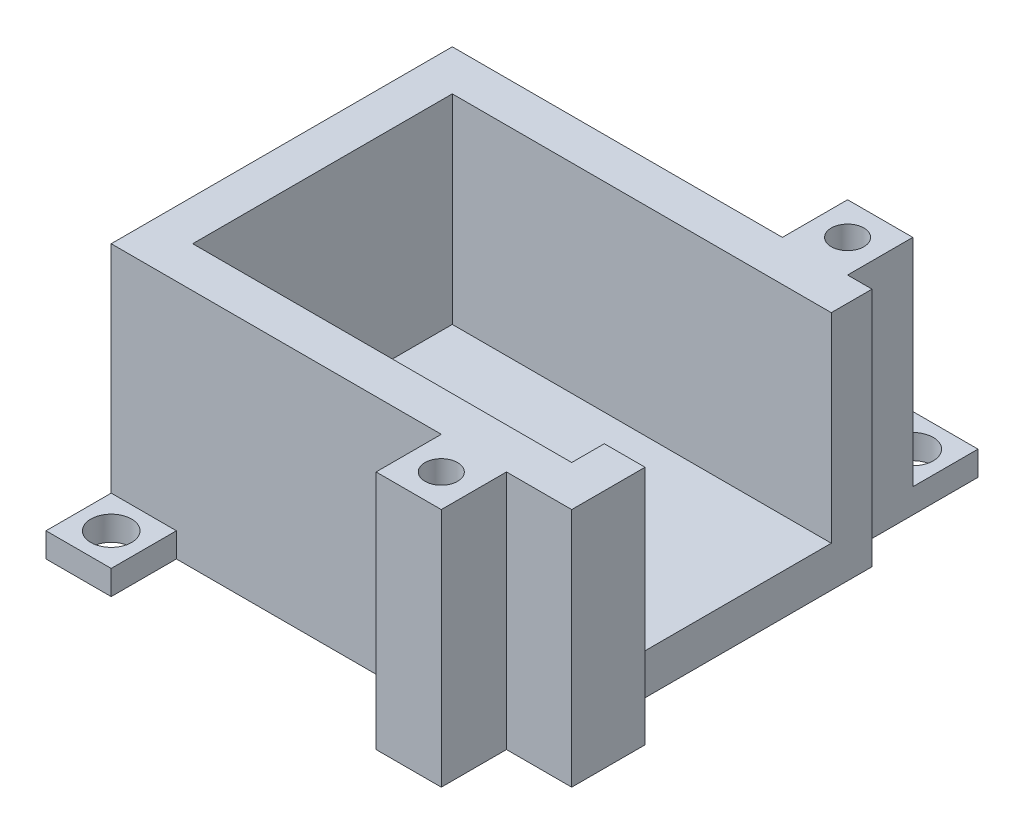
ISO-10303-21;
HEADER;
FILE_DESCRIPTION(('STEP AP214'),'2;1');
FILE_NAME('part.step','',(''),(''),'','','');
FILE_SCHEMA(('AUTOMOTIVE_DESIGN { 1 0 10303 214 1 1 1 1 }'));
ENDSEC;
DATA;
#1=APPLICATION_CONTEXT('core data for automotive mechanical design processes');
#2=APPLICATION_PROTOCOL_DEFINITION('international standard','automotive_design',2000,#1);
#3=PRODUCT_CONTEXT('',#1,'mechanical');
#4=PRODUCT('Part','Part','',(#3));
#5=PRODUCT_RELATED_PRODUCT_CATEGORY('part','',(#4));
#6=PRODUCT_DEFINITION_FORMATION('','',#4);
#7=PRODUCT_DEFINITION_CONTEXT('part definition',#1,'design');
#8=PRODUCT_DEFINITION('design','',#6,#7);
#9=PRODUCT_DEFINITION_SHAPE('','',#8);
#10=(LENGTH_UNIT() NAMED_UNIT(*) SI_UNIT(.MILLI.,.METRE.));
#11=(NAMED_UNIT(*) PLANE_ANGLE_UNIT() SI_UNIT($,.RADIAN.));
#12=(NAMED_UNIT(*) SI_UNIT($,.STERADIAN.) SOLID_ANGLE_UNIT());
#13=UNCERTAINTY_MEASURE_WITH_UNIT(LENGTH_MEASURE(1.E-05),#10,'distance_accuracy_value','');
#14=(GEOMETRIC_REPRESENTATION_CONTEXT(3) GLOBAL_UNCERTAINTY_ASSIGNED_CONTEXT((#13)) GLOBAL_UNIT_ASSIGNED_CONTEXT((#10,
#11,#12)) REPRESENTATION_CONTEXT('',''));
#15=CARTESIAN_POINT('',(0.,0.,0.));
#16=DIRECTION('',(0.,0.,1.));
#17=DIRECTION('',(1.,0.,0.));
#18=AXIS2_PLACEMENT_3D('',#15,#16,#17);
#19=CARTESIAN_POINT('',(0.,-5.,0.));
#20=DIRECTION('',(0.,-1.,0.));
#21=DIRECTION('',(0.,0.,-1.));
#22=AXIS2_PLACEMENT_3D('',#19,#20,#21);
#23=PLANE('',#22);
#24=DIRECTION('',(1.,0.,0.));
#25=VECTOR('',#24,1.);
#26=CARTESIAN_POINT('',(0.,-5.,0.));
#27=LINE('',#26,#25);
#28=CARTESIAN_POINT('',(48.5,-5.,0.));
#29=VERTEX_POINT('',#28);
#30=CARTESIAN_POINT('',(51.5,-5.,0.));
#31=VERTEX_POINT('',#30);
#32=EDGE_CURVE('E225',#29,#31,#27,.T.);
#33=ORIENTED_EDGE('',*,*,#32,.T.);
#34=DIRECTION('',(0.,0.,-1.));
#35=VECTOR('',#34,1.);
#36=CARTESIAN_POINT('',(51.5,-5.,0.));
#37=LINE('',#36,#35);
#38=CARTESIAN_POINT('',(51.5,-5.,32.85));
#39=VERTEX_POINT('',#38);
#40=EDGE_CURVE('E238',#39,#31,#37,.T.);
#41=ORIENTED_EDGE('',*,*,#40,.F.);
#42=DIRECTION('',(-1.,0.,0.));
#43=VECTOR('',#42,1.);
#44=CARTESIAN_POINT('',(0.,-5.,32.85));
#45=LINE('',#44,#43);
#46=CARTESIAN_POINT('',(56.5,-5.,32.85));
#47=VERTEX_POINT('',#46);
#48=EDGE_CURVE('E242',#47,#39,#45,.T.);
#49=ORIENTED_EDGE('',*,*,#48,.F.);
#50=DIRECTION('',(0.,0.,-1.));
#51=VECTOR('',#50,1.);
#52=CARTESIAN_POINT('',(56.5,-5.,0.));
#53=LINE('',#52,#51);
#54=CARTESIAN_POINT('',(56.5,-5.,41.85));
#55=VERTEX_POINT('',#54);
#56=EDGE_CURVE('E354',#55,#47,#53,.T.);
#57=ORIENTED_EDGE('',*,*,#56,.F.);
#58=DIRECTION('',(-1.,0.,0.));
#59=VECTOR('',#58,1.);
#60=CARTESIAN_POINT('',(0.,-5.,41.85));
#61=LINE('',#60,#59);
#62=CARTESIAN_POINT('',(48.5,-5.,41.85));
#63=VERTEX_POINT('',#62);
#64=EDGE_CURVE('E235',#55,#63,#61,.T.);
#65=ORIENTED_EDGE('',*,*,#64,.T.);
#66=DIRECTION('',(0.,0.,-1.));
#67=VECTOR('',#66,1.);
#68=CARTESIAN_POINT('',(48.5,-5.,49.85));
#69=LINE('',#68,#67);
#70=CARTESIAN_POINT('',(48.5,-5.,49.85));
#71=VERTEX_POINT('',#70);
#72=EDGE_CURVE('E307',#71,#63,#69,.T.);
#73=ORIENTED_EDGE('',*,*,#72,.F.);
#74=DIRECTION('',(1.,0.,0.));
#75=VECTOR('',#74,1.);
#76=CARTESIAN_POINT('',(48.5,-5.,49.85));
#77=LINE('',#76,#75);
#78=CARTESIAN_POINT('',(40.5,-5.,49.85));
#79=VERTEX_POINT('',#78);
#80=EDGE_CURVE('E314',#79,#71,#77,.T.);
#81=ORIENTED_EDGE('',*,*,#80,.F.);
#82=DIRECTION('',(0.,0.,-1.));
#83=VECTOR('',#82,1.);
#84=CARTESIAN_POINT('',(40.5,-5.,49.85));
#85=LINE('',#84,#83);
#86=CARTESIAN_POINT('',(40.5,-5.,41.85));
#87=VERTEX_POINT('',#86);
#88=EDGE_CURVE('E233',#79,#87,#85,.T.);
#89=ORIENTED_EDGE('',*,*,#88,.T.);
#90=CARTESIAN_POINT('',(8.00000000000001,-5.,41.85));
#91=VERTEX_POINT('',#90);
#92=EDGE_CURVE('E231',#87,#91,#61,.T.);
#93=ORIENTED_EDGE('',*,*,#92,.T.);
#94=DIRECTION('',(0.,0.,-1.));
#95=VECTOR('',#94,1.);
#96=CARTESIAN_POINT('',(8.00000000000001,-5.,49.85));
#97=LINE('',#96,#95);
#98=CARTESIAN_POINT('',(8.00000000000001,-5.,49.85));
#99=VERTEX_POINT('',#98);
#100=EDGE_CURVE('E250',#99,#91,#97,.T.);
#101=ORIENTED_EDGE('',*,*,#100,.F.);
#102=DIRECTION('',(1.,0.,0.));
#103=VECTOR('',#102,1.);
#104=CARTESIAN_POINT('',(0.,-5.,49.85));
#105=LINE('',#104,#103);
#106=CARTESIAN_POINT('',(0.,-5.,49.85));
#107=VERTEX_POINT('',#106);
#108=EDGE_CURVE('E229',#107,#99,#105,.T.);
#109=ORIENTED_EDGE('',*,*,#108,.F.);
#110=DIRECTION('',(0.,0.,-1.));
#111=VECTOR('',#110,1.);
#112=CARTESIAN_POINT('',(0.,-5.,41.85));
#113=LINE('',#112,#111);
#114=CARTESIAN_POINT('',(0.,-5.,0.));
#115=VERTEX_POINT('',#114);
#116=EDGE_CURVE('E209',#107,#115,#113,.T.);
#117=ORIENTED_EDGE('',*,*,#116,.T.);
#118=CARTESIAN_POINT('',(40.5,-5.,0.));
#119=VERTEX_POINT('',#118);
#120=EDGE_CURVE('E42',#115,#119,#27,.T.);
#121=ORIENTED_EDGE('',*,*,#120,.T.);
#122=DIRECTION('',(0.,0.,1.));
#123=VECTOR('',#122,1.);
#124=CARTESIAN_POINT('',(40.5,-5.,-8.));
#125=LINE('',#124,#123);
#126=CARTESIAN_POINT('',(40.5,-5.,-16.));
#127=VERTEX_POINT('',#126);
#128=EDGE_CURVE('E279',#127,#119,#125,.T.);
#129=ORIENTED_EDGE('',*,*,#128,.F.);
#130=DIRECTION('',(-1.,0.,0.));
#131=VECTOR('',#130,1.);
#132=CARTESIAN_POINT('',(40.5,-5.,-16.));
#133=LINE('',#132,#131);
#134=CARTESIAN_POINT('',(48.5,-5.,-16.));
#135=VERTEX_POINT('',#134);
#136=EDGE_CURVE('E343',#135,#127,#133,.T.);
#137=ORIENTED_EDGE('',*,*,#136,.F.);
#138=DIRECTION('',(0.,0.,1.));
#139=VECTOR('',#138,1.);
#140=CARTESIAN_POINT('',(48.5,-5.,-8.));
#141=LINE('',#140,#139);
#142=EDGE_CURVE('E224',#135,#29,#141,.T.);
#143=ORIENTED_EDGE('',*,*,#142,.T.);
#144=EDGE_LOOP('',(#33,#41,#49,#57,#65,#73,#81,#89,#93,#101,#109,#117,#121,#129,#137,#143));
#145=FACE_BOUND('',#144,.T.);
#146=CARTESIAN_POINT('',(4.00000000000001,-5.,45.85));
#147=DIRECTION('',(0.,-1.,0.));
#148=DIRECTION('',(0.,0.,-1.));
#149=AXIS2_PLACEMENT_3D('',#146,#147,#148);
#150=CIRCLE('',#149,2.5);
#151=CARTESIAN_POINT('',(4.00000000000001,-5.,43.35));
#152=VERTEX_POINT('',#151);
#153=EDGE_CURVE('E266',#152,#152,#150,.T.);
#154=ORIENTED_EDGE('',*,*,#153,.F.);
#155=EDGE_LOOP('',(#154));
#156=FACE_BOUND('',#155,.T.);
#157=CARTESIAN_POINT('',(44.5,-5.,-12.));
#158=DIRECTION('',(0.,-1.,0.));
#159=DIRECTION('',(0.,0.,-1.));
#160=AXIS2_PLACEMENT_3D('',#157,#158,#159);
#161=CIRCLE('',#160,2.5);
#162=CARTESIAN_POINT('',(44.5,-5.,-14.5));
#163=VERTEX_POINT('',#162);
#164=EDGE_CURVE('E48',#163,#163,#161,.T.);
#165=ORIENTED_EDGE('',*,*,#164,.F.);
#166=EDGE_LOOP('',(#165));
#167=FACE_BOUND('',#166,.T.);
#168=ADVANCED_FACE('F39',(#145,#156,#167),#23,.T.);
#169=CARTESIAN_POINT('',(0.,0.,-8.));
#170=DIRECTION('',(0.,0.,-1.));
#171=DIRECTION('',(-1.,0.,0.));
#172=AXIS2_PLACEMENT_3D('',#169,#170,#171);
#173=PLANE('',#172);
#174=DIRECTION('',(0.,-1.,0.));
#175=VECTOR('',#174,1.);
#176=CARTESIAN_POINT('',(48.5,24.5,-8.));
#177=LINE('',#176,#175);
#178=CARTESIAN_POINT('',(48.5,24.5,-8.));
#179=VERTEX_POINT('',#178);
#180=CARTESIAN_POINT('',(48.5,-1.99999999999999,-8.));
#181=VERTEX_POINT('',#180);
#182=EDGE_CURVE('E296',#179,#181,#177,.T.);
#183=ORIENTED_EDGE('',*,*,#182,.T.);
#184=DIRECTION('',(1.,0.,0.));
#185=VECTOR('',#184,1.);
#186=CARTESIAN_POINT('',(40.5,-2.,-8.));
#187=LINE('',#186,#185);
#188=CARTESIAN_POINT('',(40.5,-1.99999999999999,-8.));
#189=VERTEX_POINT('',#188);
#190=EDGE_CURVE('E334',#189,#181,#187,.T.);
#191=ORIENTED_EDGE('',*,*,#190,.F.);
#192=DIRECTION('',(0.,1.,0.));
#193=VECTOR('',#192,1.);
#194=CARTESIAN_POINT('',(40.5,24.5,-8.));
#195=LINE('',#194,#193);
#196=CARTESIAN_POINT('',(40.5,24.5,-8.));
#197=VERTEX_POINT('',#196);
#198=EDGE_CURVE('E294',#189,#197,#195,.T.);
#199=ORIENTED_EDGE('',*,*,#198,.T.);
#200=DIRECTION('',(1.,0.,0.));
#201=VECTOR('',#200,1.);
#202=CARTESIAN_POINT('',(48.5,24.5,-8.));
#203=LINE('',#202,#201);
#204=EDGE_CURVE('E291',#197,#179,#203,.T.);
#205=ORIENTED_EDGE('',*,*,#204,.T.);
#206=EDGE_LOOP('',(#183,#191,#199,#205));
#207=FACE_BOUND('',#206,.T.);
#208=ADVANCED_FACE('F484',(#207),#173,.T.);
#209=CARTESIAN_POINT('',(56.5,24.5,41.85));
#210=DIRECTION('',(0.,0.,-1.));
#211=DIRECTION('',(-1.,0.,0.));
#212=AXIS2_PLACEMENT_3D('',#209,#210,#211);
#213=PLANE('',#212);
#214=ORIENTED_EDGE('',*,*,#64,.F.);
#215=DIRECTION('',(0.,-1.,0.));
#216=VECTOR('',#215,1.);
#217=CARTESIAN_POINT('',(56.5,24.5,41.85));
#218=LINE('',#217,#216);
#219=CARTESIAN_POINT('',(56.5,24.5,41.85));
#220=VERTEX_POINT('',#219);
#221=EDGE_CURVE('E150',#220,#55,#218,.T.);
#222=ORIENTED_EDGE('',*,*,#221,.F.);
#223=DIRECTION('',(1.,0.,0.));
#224=VECTOR('',#223,1.);
#225=CARTESIAN_POINT('',(56.5,24.5,41.85));
#226=LINE('',#225,#224);
#227=CARTESIAN_POINT('',(48.5,24.5,41.85));
#228=VERTEX_POINT('',#227);
#229=EDGE_CURVE('E300',#228,#220,#226,.T.);
#230=ORIENTED_EDGE('',*,*,#229,.F.);
#231=DIRECTION('',(0.,1.,0.));
#232=VECTOR('',#231,1.);
#233=CARTESIAN_POINT('',(48.5,24.5,41.85));
#234=LINE('',#233,#232);
#235=EDGE_CURVE('E281',#63,#228,#234,.T.);
#236=ORIENTED_EDGE('',*,*,#235,.F.);
#237=EDGE_LOOP('',(#214,#222,#230,#236));
#238=FACE_BOUND('',#237,.T.);
#239=ADVANCED_FACE('F435',(#238),#213,.F.);
#240=DIRECTION('',(0.,-1.,0.));
#241=VECTOR('',#240,1.);
#242=CARTESIAN_POINT('',(40.5,24.5,41.85));
#243=LINE('',#242,#241);
#244=CARTESIAN_POINT('',(40.5,24.5,41.85));
#245=VERTEX_POINT('',#244);
#246=EDGE_CURVE('E305',#245,#87,#243,.T.);
#247=ORIENTED_EDGE('',*,*,#246,.F.);
#248=CARTESIAN_POINT('',(0.,24.5,41.85));
#249=VERTEX_POINT('',#248);
#250=EDGE_CURVE('E301',#249,#245,#226,.T.);
#251=ORIENTED_EDGE('',*,*,#250,.F.);
#252=DIRECTION('',(0.,-1.,0.));
#253=VECTOR('',#252,1.);
#254=CARTESIAN_POINT('',(0.,24.5,41.85));
#255=LINE('',#254,#253);
#256=CARTESIAN_POINT('',(0.,-2.,41.85));
#257=VERTEX_POINT('',#256);
#258=EDGE_CURVE('E293',#249,#257,#255,.T.);
#259=ORIENTED_EDGE('',*,*,#258,.T.);
#260=DIRECTION('',(-1.,0.,0.));
#261=VECTOR('',#260,1.);
#262=CARTESIAN_POINT('',(0.,-2.,41.85));
#263=LINE('',#262,#261);
#264=CARTESIAN_POINT('',(8.00000000000001,-2.,41.85));
#265=VERTEX_POINT('',#264);
#266=EDGE_CURVE('E253',#265,#257,#263,.T.);
#267=ORIENTED_EDGE('',*,*,#266,.F.);
#268=DIRECTION('',(0.,1.,0.));
#269=VECTOR('',#268,1.);
#270=CARTESIAN_POINT('',(8.00000000000001,-2.,41.85));
#271=LINE('',#270,#269);
#272=EDGE_CURVE('E249',#91,#265,#271,.T.);
#273=ORIENTED_EDGE('',*,*,#272,.F.);
#274=ORIENTED_EDGE('',*,*,#92,.F.);
#275=EDGE_LOOP('',(#247,#251,#259,#267,#273,#274));
#276=FACE_BOUND('',#275,.T.);
#277=ADVANCED_FACE('F409',(#276),#213,.F.);
#278=CARTESIAN_POINT('',(0.,24.5,0.));
#279=DIRECTION('',(0.,0.,1.));
#280=DIRECTION('',(1.,0.,0.));
#281=AXIS2_PLACEMENT_3D('',#278,#279,#280);
#282=PLANE('',#281);
#283=DIRECTION('',(0.,-1.,0.));
#284=VECTOR('',#283,1.);
#285=CARTESIAN_POINT('',(51.5,24.5,0.));
#286=LINE('',#285,#284);
#287=CARTESIAN_POINT('',(51.5,24.5,0.));
#288=VERTEX_POINT('',#287);
#289=EDGE_CURVE('E217',#288,#31,#286,.T.);
#290=ORIENTED_EDGE('',*,*,#289,.T.);
#291=ORIENTED_EDGE('',*,*,#32,.F.);
#292=DIRECTION('',(0.,-1.,0.));
#293=VECTOR('',#292,1.);
#294=CARTESIAN_POINT('',(48.5,24.5,0.));
#295=LINE('',#294,#293);
#296=CARTESIAN_POINT('',(48.5,24.5,0.));
#297=VERTEX_POINT('',#296);
#298=EDGE_CURVE('E276',#297,#29,#295,.T.);
#299=ORIENTED_EDGE('',*,*,#298,.F.);
#300=DIRECTION('',(-1.,0.,0.));
#301=VECTOR('',#300,1.);
#302=CARTESIAN_POINT('',(0.,24.5,0.));
#303=LINE('',#302,#301);
#304=EDGE_CURVE('E285',#288,#297,#303,.T.);
#305=ORIENTED_EDGE('',*,*,#304,.F.);
#306=EDGE_LOOP('',(#290,#291,#299,#305));
#307=FACE_BOUND('',#306,.T.);
#308=ADVANCED_FACE('F466',(#307),#282,.F.);
#309=DIRECTION('',(0.,1.,0.));
#310=VECTOR('',#309,1.);
#311=CARTESIAN_POINT('',(40.5,24.5,0.));
#312=LINE('',#311,#310);
#313=CARTESIAN_POINT('',(40.5,24.5,0.));
#314=VERTEX_POINT('',#313);
#315=EDGE_CURVE('E222',#119,#314,#312,.T.);
#316=ORIENTED_EDGE('',*,*,#315,.F.);
#317=ORIENTED_EDGE('',*,*,#120,.F.);
#318=DIRECTION('',(0.,-1.,0.));
#319=VECTOR('',#318,1.);
#320=CARTESIAN_POINT('',(0.,24.5,0.));
#321=LINE('',#320,#319);
#322=CARTESIAN_POINT('',(0.,24.5,0.));
#323=VERTEX_POINT('',#322);
#324=EDGE_CURVE('E204',#323,#115,#321,.T.);
#325=ORIENTED_EDGE('',*,*,#324,.F.);
#326=EDGE_CURVE('E241',#314,#323,#303,.T.);
#327=ORIENTED_EDGE('',*,*,#326,.F.);
#328=EDGE_LOOP('',(#316,#317,#325,#327));
#329=FACE_BOUND('',#328,.T.);
#330=ADVANCED_FACE('F221',(#329),#282,.F.);
#331=CARTESIAN_POINT('',(0.,0.,0.));
#332=DIRECTION('',(0.,-1.,0.));
#333=DIRECTION('',(0.,0.,-1.));
#334=AXIS2_PLACEMENT_3D('',#331,#332,#333);
#335=PLANE('',#334);
#336=DIRECTION('',(0.,0.,1.));
#337=VECTOR('',#336,1.);
#338=CARTESIAN_POINT('',(51.5,0.,36.85));
#339=LINE('',#338,#337);
#340=CARTESIAN_POINT('',(51.5,0.,32.85));
#341=VERTEX_POINT('',#340);
#342=CARTESIAN_POINT('',(51.5,0.,36.85));
#343=VERTEX_POINT('',#342);
#344=EDGE_CURVE('E247',#341,#343,#339,.T.);
#345=ORIENTED_EDGE('',*,*,#344,.F.);
#346=DIRECTION('',(0.,0.,1.));
#347=VECTOR('',#346,1.);
#348=CARTESIAN_POINT('',(51.5,0.,5.));
#349=LINE('',#348,#347);
#350=CARTESIAN_POINT('',(51.5,0.,5.));
#351=VERTEX_POINT('',#350);
#352=EDGE_CURVE('E56',#351,#341,#349,.T.);
#353=ORIENTED_EDGE('',*,*,#352,.F.);
#354=DIRECTION('',(1.,0.,0.));
#355=VECTOR('',#354,1.);
#356=CARTESIAN_POINT('',(51.5,0.,5.));
#357=LINE('',#356,#355);
#358=CARTESIAN_POINT('',(4.99999999999999,0.,5.));
#359=VERTEX_POINT('',#358);
#360=EDGE_CURVE('E371',#359,#351,#357,.T.);
#361=ORIENTED_EDGE('',*,*,#360,.F.);
#362=DIRECTION('',(0.,0.,-1.));
#363=VECTOR('',#362,1.);
#364=CARTESIAN_POINT('',(4.99999999999999,0.,5.));
#365=LINE('',#364,#363);
#366=CARTESIAN_POINT('',(4.99999999999999,0.,36.85));
#367=VERTEX_POINT('',#366);
#368=EDGE_CURVE('E367',#367,#359,#365,.T.);
#369=ORIENTED_EDGE('',*,*,#368,.F.);
#370=DIRECTION('',(-1.,0.,0.));
#371=VECTOR('',#370,1.);
#372=CARTESIAN_POINT('',(4.99999999999999,0.,36.85));
#373=LINE('',#372,#371);
#374=EDGE_CURVE('E363',#343,#367,#373,.T.);
#375=ORIENTED_EDGE('',*,*,#374,.F.);
#376=EDGE_LOOP('',(#345,#353,#361,#369,#375));
#377=FACE_BOUND('',#376,.T.);
#378=ADVANCED_FACE('F528',(#377),#335,.F.);
#379=CARTESIAN_POINT('',(0.,24.5,41.85));
#380=DIRECTION('',(1.,0.,0.));
#381=DIRECTION('',(0.,0.,-1.));
#382=AXIS2_PLACEMENT_3D('',#379,#380,#381);
#383=PLANE('',#382);
#384=ORIENTED_EDGE('',*,*,#324,.T.);
#385=ORIENTED_EDGE('',*,*,#116,.F.);
#386=DIRECTION('',(0.,-1.,0.));
#387=VECTOR('',#386,1.);
#388=CARTESIAN_POINT('',(0.,-2.,49.85));
#389=LINE('',#388,#387);
#390=CARTESIAN_POINT('',(0.,-2.,49.85));
#391=VERTEX_POINT('',#390);
#392=EDGE_CURVE('E257',#391,#107,#389,.T.);
#393=ORIENTED_EDGE('',*,*,#392,.F.);
#394=DIRECTION('',(0.,0.,-1.));
#395=VECTOR('',#394,1.);
#396=CARTESIAN_POINT('',(0.,-2.,49.85));
#397=LINE('',#396,#395);
#398=EDGE_CURVE('E216',#391,#257,#397,.T.);
#399=ORIENTED_EDGE('',*,*,#398,.T.);
#400=ORIENTED_EDGE('',*,*,#258,.F.);
#401=DIRECTION('',(0.,0.,1.));
#402=VECTOR('',#401,1.);
#403=CARTESIAN_POINT('',(0.,24.5,41.85));
#404=LINE('',#403,#402);
#405=EDGE_CURVE('E213',#323,#249,#404,.T.);
#406=ORIENTED_EDGE('',*,*,#405,.F.);
#407=EDGE_LOOP('',(#384,#385,#393,#399,#400,#406));
#408=FACE_BOUND('',#407,.T.);
#409=ADVANCED_FACE('F206',(#408),#383,.F.);
#410=CARTESIAN_POINT('',(56.5,24.5,32.85));
#411=DIRECTION('',(-1.,0.,0.));
#412=DIRECTION('',(0.,0.,1.));
#413=AXIS2_PLACEMENT_3D('',#410,#411,#412);
#414=PLANE('',#413);
#415=ORIENTED_EDGE('',*,*,#221,.T.);
#416=ORIENTED_EDGE('',*,*,#56,.T.);
#417=DIRECTION('',(0.,-1.,0.));
#418=VECTOR('',#417,1.);
#419=CARTESIAN_POINT('',(56.5,24.5,32.85));
#420=LINE('',#419,#418);
#421=CARTESIAN_POINT('',(56.5,24.5,32.85));
#422=VERTEX_POINT('',#421);
#423=EDGE_CURVE('E143',#422,#47,#420,.T.);
#424=ORIENTED_EDGE('',*,*,#423,.F.);
#425=DIRECTION('',(0.,0.,-1.));
#426=VECTOR('',#425,1.);
#427=CARTESIAN_POINT('',(56.5,24.5,32.85));
#428=LINE('',#427,#426);
#429=EDGE_CURVE('E400',#220,#422,#428,.T.);
#430=ORIENTED_EDGE('',*,*,#429,.F.);
#431=EDGE_LOOP('',(#415,#416,#424,#430));
#432=FACE_BOUND('',#431,.T.);
#433=ADVANCED_FACE('F437',(#432),#414,.F.);
#434=CARTESIAN_POINT('',(51.5,24.5,32.85));
#435=DIRECTION('',(0.,0.,1.));
#436=DIRECTION('',(1.,0.,0.));
#437=AXIS2_PLACEMENT_3D('',#434,#435,#436);
#438=PLANE('',#437);
#439=ORIENTED_EDGE('',*,*,#423,.T.);
#440=ORIENTED_EDGE('',*,*,#48,.T.);
#441=DIRECTION('',(0.,1.,0.));
#442=VECTOR('',#441,1.);
#443=CARTESIAN_POINT('',(51.5,-26.,32.85));
#444=LINE('',#443,#442);
#445=EDGE_CURVE('E244',#39,#341,#444,.T.);
#446=ORIENTED_EDGE('',*,*,#445,.T.);
#447=DIRECTION('',(0.,-1.,0.));
#448=VECTOR('',#447,1.);
#449=CARTESIAN_POINT('',(51.5,24.5,32.85));
#450=LINE('',#449,#448);
#451=CARTESIAN_POINT('',(51.5,24.5,32.85));
#452=VERTEX_POINT('',#451);
#453=EDGE_CURVE('E360',#452,#341,#450,.T.);
#454=ORIENTED_EDGE('',*,*,#453,.F.);
#455=DIRECTION('',(-1.,0.,0.));
#456=VECTOR('',#455,1.);
#457=CARTESIAN_POINT('',(51.5,24.5,32.85));
#458=LINE('',#457,#456);
#459=EDGE_CURVE('E398',#422,#452,#458,.T.);
#460=ORIENTED_EDGE('',*,*,#459,.F.);
#461=EDGE_LOOP('',(#439,#440,#446,#454,#460));
#462=FACE_BOUND('',#461,.T.);
#463=ADVANCED_FACE('F438',(#462),#438,.F.);
#464=CARTESIAN_POINT('',(51.5,24.5,36.85));
#465=DIRECTION('',(1.,0.,0.));
#466=DIRECTION('',(0.,0.,-1.));
#467=AXIS2_PLACEMENT_3D('',#464,#465,#466);
#468=PLANE('',#467);
#469=ORIENTED_EDGE('',*,*,#344,.T.);
#470=DIRECTION('',(0.,-1.,0.));
#471=VECTOR('',#470,1.);
#472=CARTESIAN_POINT('',(51.5,24.5,36.85));
#473=LINE('',#472,#471);
#474=CARTESIAN_POINT('',(51.5,24.5,36.85));
#475=VERTEX_POINT('',#474);
#476=EDGE_CURVE('E364',#475,#343,#473,.T.);
#477=ORIENTED_EDGE('',*,*,#476,.F.);
#478=DIRECTION('',(0.,0.,1.));
#479=VECTOR('',#478,1.);
#480=CARTESIAN_POINT('',(51.5,24.5,36.85));
#481=LINE('',#480,#479);
#482=EDGE_CURVE('E396',#452,#475,#481,.T.);
#483=ORIENTED_EDGE('',*,*,#482,.F.);
#484=ORIENTED_EDGE('',*,*,#453,.T.);
#485=EDGE_LOOP('',(#469,#477,#483,#484));
#486=FACE_BOUND('',#485,.T.);
#487=ADVANCED_FACE('F443',(#486),#468,.F.);
#488=CARTESIAN_POINT('',(4.99999999999999,24.5,36.85));
#489=DIRECTION('',(0.,0.,1.));
#490=DIRECTION('',(1.,0.,0.));
#491=AXIS2_PLACEMENT_3D('',#488,#489,#490);
#492=PLANE('',#491);
#493=ORIENTED_EDGE('',*,*,#374,.T.);
#494=DIRECTION('',(0.,-1.,0.));
#495=VECTOR('',#494,1.);
#496=CARTESIAN_POINT('',(4.99999999999999,24.5,36.85));
#497=LINE('',#496,#495);
#498=CARTESIAN_POINT('',(4.99999999999999,24.5,36.85));
#499=VERTEX_POINT('',#498);
#500=EDGE_CURVE('E368',#499,#367,#497,.T.);
#501=ORIENTED_EDGE('',*,*,#500,.F.);
#502=DIRECTION('',(-1.,0.,0.));
#503=VECTOR('',#502,1.);
#504=CARTESIAN_POINT('',(4.99999999999999,24.5,36.85));
#505=LINE('',#504,#503);
#506=EDGE_CURVE('E394',#475,#499,#505,.T.);
#507=ORIENTED_EDGE('',*,*,#506,.F.);
#508=ORIENTED_EDGE('',*,*,#476,.T.);
#509=EDGE_LOOP('',(#493,#501,#507,#508));
#510=FACE_BOUND('',#509,.T.);
#511=ADVANCED_FACE('F449',(#510),#492,.F.);
#512=CARTESIAN_POINT('',(4.99999999999999,24.5,5.));
#513=DIRECTION('',(-1.,0.,0.));
#514=DIRECTION('',(0.,0.,1.));
#515=AXIS2_PLACEMENT_3D('',#512,#513,#514);
#516=PLANE('',#515);
#517=ORIENTED_EDGE('',*,*,#368,.T.);
#518=DIRECTION('',(0.,-1.,0.));
#519=VECTOR('',#518,1.);
#520=CARTESIAN_POINT('',(4.99999999999999,24.5,5.));
#521=LINE('',#520,#519);
#522=CARTESIAN_POINT('',(4.99999999999999,24.5,5.));
#523=VERTEX_POINT('',#522);
#524=EDGE_CURVE('E372',#523,#359,#521,.T.);
#525=ORIENTED_EDGE('',*,*,#524,.F.);
#526=DIRECTION('',(0.,0.,-1.));
#527=VECTOR('',#526,1.);
#528=CARTESIAN_POINT('',(4.99999999999999,24.5,5.));
#529=LINE('',#528,#527);
#530=EDGE_CURVE('E392',#499,#523,#529,.T.);
#531=ORIENTED_EDGE('',*,*,#530,.F.);
#532=ORIENTED_EDGE('',*,*,#500,.T.);
#533=EDGE_LOOP('',(#517,#525,#531,#532));
#534=FACE_BOUND('',#533,.T.);
#535=ADVANCED_FACE('F451',(#534),#516,.F.);
#536=CARTESIAN_POINT('',(51.5,24.5,5.));
#537=DIRECTION('',(0.,0.,-1.));
#538=DIRECTION('',(-1.,0.,0.));
#539=AXIS2_PLACEMENT_3D('',#536,#537,#538);
#540=PLANE('',#539);
#541=ORIENTED_EDGE('',*,*,#360,.T.);
#542=DIRECTION('',(0.,-1.,0.));
#543=VECTOR('',#542,1.);
#544=CARTESIAN_POINT('',(51.5,24.5,5.));
#545=LINE('',#544,#543);
#546=CARTESIAN_POINT('',(51.5,24.5,5.));
#547=VERTEX_POINT('',#546);
#548=EDGE_CURVE('E375',#547,#351,#545,.T.);
#549=ORIENTED_EDGE('',*,*,#548,.F.);
#550=DIRECTION('',(1.,0.,0.));
#551=VECTOR('',#550,1.);
#552=CARTESIAN_POINT('',(51.5,24.5,5.));
#553=LINE('',#552,#551);
#554=EDGE_CURVE('E390',#523,#547,#553,.T.);
#555=ORIENTED_EDGE('',*,*,#554,.F.);
#556=ORIENTED_EDGE('',*,*,#524,.T.);
#557=EDGE_LOOP('',(#541,#549,#555,#556));
#558=FACE_BOUND('',#557,.T.);
#559=ADVANCED_FACE('F455',(#558),#540,.F.);
#560=CARTESIAN_POINT('',(51.5,24.5,0.));
#561=DIRECTION('',(-1.,0.,0.));
#562=DIRECTION('',(0.,0.,1.));
#563=AXIS2_PLACEMENT_3D('',#560,#561,#562);
#564=PLANE('',#563);
#565=ORIENTED_EDGE('',*,*,#548,.T.);
#566=ORIENTED_EDGE('',*,*,#352,.T.);
#567=ORIENTED_EDGE('',*,*,#445,.F.);
#568=ORIENTED_EDGE('',*,*,#40,.T.);
#569=ORIENTED_EDGE('',*,*,#289,.F.);
#570=DIRECTION('',(0.,0.,-1.));
#571=VECTOR('',#570,1.);
#572=CARTESIAN_POINT('',(51.5,24.5,0.));
#573=LINE('',#572,#571);
#574=EDGE_CURVE('E388',#547,#288,#573,.T.);
#575=ORIENTED_EDGE('',*,*,#574,.F.);
#576=EDGE_LOOP('',(#565,#566,#567,#568,#569,#575));
#577=FACE_BOUND('',#576,.T.);
#578=ADVANCED_FACE('F461',(#577),#564,.F.);
#579=CARTESIAN_POINT('',(0.,24.5,0.));
#580=DIRECTION('',(0.,-1.,0.));
#581=DIRECTION('',(0.,0.,-1.));
#582=AXIS2_PLACEMENT_3D('',#579,#580,#581);
#583=PLANE('',#582);
#584=CARTESIAN_POINT('',(44.5,24.5,-4.));
#585=DIRECTION('',(0.,1.,0.));
#586=DIRECTION('',(0.,0.,1.));
#587=AXIS2_PLACEMENT_3D('',#584,#585,#586);
#588=CIRCLE('',#587,2.);
#589=CARTESIAN_POINT('',(44.5,24.5,-2.));
#590=VERTEX_POINT('',#589);
#591=EDGE_CURVE('E326',#590,#590,#588,.T.);
#592=ORIENTED_EDGE('',*,*,#591,.F.);
#593=EDGE_LOOP('',(#592));
#594=FACE_BOUND('',#593,.T.);
#595=CARTESIAN_POINT('',(44.5,24.5,45.85));
#596=DIRECTION('',(0.,1.,0.));
#597=DIRECTION('',(0.,0.,1.));
#598=AXIS2_PLACEMENT_3D('',#595,#596,#597);
#599=CIRCLE('',#598,2.);
#600=CARTESIAN_POINT('',(44.5,24.5,47.85));
#601=VERTEX_POINT('',#600);
#602=EDGE_CURVE('E316',#601,#601,#599,.T.);
#603=ORIENTED_EDGE('',*,*,#602,.F.);
#604=EDGE_LOOP('',(#603));
#605=FACE_BOUND('',#604,.T.);
#606=ORIENTED_EDGE('',*,*,#405,.T.);
#607=ORIENTED_EDGE('',*,*,#250,.T.);
#608=DIRECTION('',(0.,0.,-1.));
#609=VECTOR('',#608,1.);
#610=CARTESIAN_POINT('',(40.5,24.5,49.85));
#611=LINE('',#610,#609);
#612=CARTESIAN_POINT('',(40.5,24.5,49.85));
#613=VERTEX_POINT('',#612);
#614=EDGE_CURVE('E302',#613,#245,#611,.T.);
#615=ORIENTED_EDGE('',*,*,#614,.F.);
#616=DIRECTION('',(-1.,0.,0.));
#617=VECTOR('',#616,1.);
#618=CARTESIAN_POINT('',(48.5,24.5,49.85));
#619=LINE('',#618,#617);
#620=CARTESIAN_POINT('',(48.5,24.5,49.85));
#621=VERTEX_POINT('',#620);
#622=EDGE_CURVE('E319',#621,#613,#619,.T.);
#623=ORIENTED_EDGE('',*,*,#622,.F.);
#624=DIRECTION('',(0.,0.,-1.));
#625=VECTOR('',#624,1.);
#626=CARTESIAN_POINT('',(48.5,24.5,49.85));
#627=LINE('',#626,#625);
#628=EDGE_CURVE('E298',#621,#228,#627,.T.);
#629=ORIENTED_EDGE('',*,*,#628,.T.);
#630=ORIENTED_EDGE('',*,*,#229,.T.);
#631=ORIENTED_EDGE('',*,*,#429,.T.);
#632=ORIENTED_EDGE('',*,*,#459,.T.);
#633=ORIENTED_EDGE('',*,*,#482,.T.);
#634=ORIENTED_EDGE('',*,*,#506,.T.);
#635=ORIENTED_EDGE('',*,*,#530,.T.);
#636=ORIENTED_EDGE('',*,*,#554,.T.);
#637=ORIENTED_EDGE('',*,*,#574,.T.);
#638=ORIENTED_EDGE('',*,*,#304,.T.);
#639=DIRECTION('',(0.,0.,1.));
#640=VECTOR('',#639,1.);
#641=CARTESIAN_POINT('',(48.5,24.5,-8.));
#642=LINE('',#641,#640);
#643=EDGE_CURVE('E286',#179,#297,#642,.T.);
#644=ORIENTED_EDGE('',*,*,#643,.F.);
#645=ORIENTED_EDGE('',*,*,#204,.F.);
#646=DIRECTION('',(0.,0.,1.));
#647=VECTOR('',#646,1.);
#648=CARTESIAN_POINT('',(40.5,24.5,-8.));
#649=LINE('',#648,#647);
#650=EDGE_CURVE('E282',#197,#314,#649,.T.);
#651=ORIENTED_EDGE('',*,*,#650,.T.);
#652=ORIENTED_EDGE('',*,*,#326,.T.);
#653=EDGE_LOOP('',(#606,#607,#615,#623,#629,#630,#631,#632,#633,#634,#635,#636,#637,#638,#644,
#645,#651,#652));
#654=FACE_BOUND('',#653,.T.);
#655=ADVANCED_FACE('F404',(#594,#605,#654),#583,.F.);
#656=CARTESIAN_POINT('',(8.00000000000001,-2.,49.85));
#657=DIRECTION('',(-1.,0.,0.));
#658=DIRECTION('',(0.,0.,1.));
#659=AXIS2_PLACEMENT_3D('',#656,#657,#658);
#660=PLANE('',#659);
#661=ORIENTED_EDGE('',*,*,#272,.T.);
#662=DIRECTION('',(0.,0.,-1.));
#663=VECTOR('',#662,1.);
#664=CARTESIAN_POINT('',(8.00000000000001,-2.,49.85));
#665=LINE('',#664,#663);
#666=CARTESIAN_POINT('',(8.00000000000001,-2.,49.85));
#667=VERTEX_POINT('',#666);
#668=EDGE_CURVE('E254',#667,#265,#665,.T.);
#669=ORIENTED_EDGE('',*,*,#668,.F.);
#670=DIRECTION('',(0.,1.,0.));
#671=VECTOR('',#670,1.);
#672=CARTESIAN_POINT('',(8.00000000000001,-2.,49.85));
#673=LINE('',#672,#671);
#674=EDGE_CURVE('E267',#99,#667,#673,.T.);
#675=ORIENTED_EDGE('',*,*,#674,.F.);
#676=ORIENTED_EDGE('',*,*,#100,.T.);
#677=EDGE_LOOP('',(#661,#669,#675,#676));
#678=FACE_BOUND('',#677,.T.);
#679=ADVANCED_FACE('F417',(#678),#660,.F.);
#680=CARTESIAN_POINT('',(0.,-2.,49.85));
#681=DIRECTION('',(0.,-1.,0.));
#682=DIRECTION('',(0.,0.,-1.));
#683=AXIS2_PLACEMENT_3D('',#680,#681,#682);
#684=PLANE('',#683);
#685=CARTESIAN_POINT('',(4.00000000000001,-2.,45.85));
#686=DIRECTION('',(0.,1.,0.));
#687=DIRECTION('',(0.,0.,1.));
#688=AXIS2_PLACEMENT_3D('',#685,#686,#687);
#689=CIRCLE('',#688,2.5);
#690=CARTESIAN_POINT('',(4.00000000000001,-2.,48.35));
#691=VERTEX_POINT('',#690);
#692=EDGE_CURVE('E273',#691,#691,#689,.T.);
#693=ORIENTED_EDGE('',*,*,#692,.F.);
#694=EDGE_LOOP('',(#693));
#695=FACE_BOUND('',#694,.T.);
#696=ORIENTED_EDGE('',*,*,#266,.T.);
#697=ORIENTED_EDGE('',*,*,#398,.F.);
#698=DIRECTION('',(-1.,0.,0.));
#699=VECTOR('',#698,1.);
#700=CARTESIAN_POINT('',(0.,-2.,49.85));
#701=LINE('',#700,#699);
#702=EDGE_CURVE('E264',#667,#391,#701,.T.);
#703=ORIENTED_EDGE('',*,*,#702,.F.);
#704=ORIENTED_EDGE('',*,*,#668,.T.);
#705=EDGE_LOOP('',(#696,#697,#703,#704));
#706=FACE_BOUND('',#705,.T.);
#707=ADVANCED_FACE('F412',(#695,#706),#684,.F.);
#708=CARTESIAN_POINT('',(0.,0.,49.85));
#709=DIRECTION('',(0.,0.,1.));
#710=DIRECTION('',(1.,0.,0.));
#711=AXIS2_PLACEMENT_3D('',#708,#709,#710);
#712=PLANE('',#711);
#713=ORIENTED_EDGE('',*,*,#392,.T.);
#714=ORIENTED_EDGE('',*,*,#108,.T.);
#715=ORIENTED_EDGE('',*,*,#674,.T.);
#716=ORIENTED_EDGE('',*,*,#702,.T.);
#717=EDGE_LOOP('',(#713,#714,#715,#716));
#718=FACE_BOUND('',#717,.T.);
#719=ADVANCED_FACE('F560',(#718),#712,.T.);
#720=CARTESIAN_POINT('',(4.00000000000001,-10.,45.85));
#721=DIRECTION('',(0.,1.,0.));
#722=DIRECTION('',(0.,0.,1.));
#723=AXIS2_PLACEMENT_3D('',#720,#721,#722);
#724=CYLINDRICAL_SURFACE('',#723,2.5);
#725=ORIENTED_EDGE('',*,*,#153,.T.);
#726=EDGE_LOOP('',(#725));
#727=FACE_BOUND('',#726,.T.);
#728=ORIENTED_EDGE('',*,*,#692,.T.);
#729=EDGE_LOOP('',(#728));
#730=FACE_BOUND('',#729,.T.);
#731=ADVANCED_FACE('F564',(#727,#730),#724,.F.);
#732=CARTESIAN_POINT('',(48.5,24.5,-8.));
#733=DIRECTION('',(-1.,0.,0.));
#734=DIRECTION('',(0.,-1.,0.));
#735=AXIS2_PLACEMENT_3D('',#732,#733,#734);
#736=PLANE('',#735);
#737=ORIENTED_EDGE('',*,*,#298,.T.);
#738=ORIENTED_EDGE('',*,*,#142,.F.);
#739=DIRECTION('',(0.,-1.,0.));
#740=VECTOR('',#739,1.);
#741=CARTESIAN_POINT('',(48.5,-5.,-16.));
#742=LINE('',#741,#740);
#743=CARTESIAN_POINT('',(48.5,-2.,-16.));
#744=VERTEX_POINT('',#743);
#745=EDGE_CURVE('E346',#744,#135,#742,.T.);
#746=ORIENTED_EDGE('',*,*,#745,.F.);
#747=DIRECTION('',(0.,0.,1.));
#748=VECTOR('',#747,1.);
#749=CARTESIAN_POINT('',(48.5,-2.,-16.));
#750=LINE('',#749,#748);
#751=EDGE_CURVE('E288',#744,#181,#750,.T.);
#752=ORIENTED_EDGE('',*,*,#751,.T.);
#753=ORIENTED_EDGE('',*,*,#182,.F.);
#754=ORIENTED_EDGE('',*,*,#643,.T.);
#755=EDGE_LOOP('',(#737,#738,#746,#752,#753,#754));
#756=FACE_BOUND('',#755,.T.);
#757=ADVANCED_FACE('F468',(#756),#736,.F.);
#758=CARTESIAN_POINT('',(40.5,24.5,-8.));
#759=DIRECTION('',(1.,0.,0.));
#760=DIRECTION('',(0.,0.,-1.));
#761=AXIS2_PLACEMENT_3D('',#758,#759,#760);
#762=PLANE('',#761);
#763=ORIENTED_EDGE('',*,*,#315,.T.);
#764=ORIENTED_EDGE('',*,*,#650,.F.);
#765=ORIENTED_EDGE('',*,*,#198,.F.);
#766=DIRECTION('',(0.,0.,1.));
#767=VECTOR('',#766,1.);
#768=CARTESIAN_POINT('',(40.5,-2.,-16.));
#769=LINE('',#768,#767);
#770=CARTESIAN_POINT('',(40.5,-2.,-16.));
#771=VERTEX_POINT('',#770);
#772=EDGE_CURVE('E335',#771,#189,#769,.T.);
#773=ORIENTED_EDGE('',*,*,#772,.F.);
#774=DIRECTION('',(0.,1.,0.));
#775=VECTOR('',#774,1.);
#776=CARTESIAN_POINT('',(40.5,-5.,-16.));
#777=LINE('',#776,#775);
#778=EDGE_CURVE('E338',#127,#771,#777,.T.);
#779=ORIENTED_EDGE('',*,*,#778,.F.);
#780=ORIENTED_EDGE('',*,*,#128,.T.);
#781=EDGE_LOOP('',(#763,#764,#765,#773,#779,#780));
#782=FACE_BOUND('',#781,.T.);
#783=ADVANCED_FACE('F477',(#782),#762,.F.);
#784=CARTESIAN_POINT('',(48.5,24.5,49.85));
#785=DIRECTION('',(-1.,0.,0.));
#786=DIRECTION('',(0.,0.,1.));
#787=AXIS2_PLACEMENT_3D('',#784,#785,#786);
#788=PLANE('',#787);
#789=ORIENTED_EDGE('',*,*,#235,.T.);
#790=ORIENTED_EDGE('',*,*,#628,.F.);
#791=DIRECTION('',(0.,1.,0.));
#792=VECTOR('',#791,1.);
#793=CARTESIAN_POINT('',(48.5,24.5,49.85));
#794=LINE('',#793,#792);
#795=EDGE_CURVE('E304',#71,#621,#794,.T.);
#796=ORIENTED_EDGE('',*,*,#795,.F.);
#797=ORIENTED_EDGE('',*,*,#72,.T.);
#798=EDGE_LOOP('',(#789,#790,#796,#797));
#799=FACE_BOUND('',#798,.T.);
#800=ADVANCED_FACE('F430',(#799),#788,.F.);
#801=CARTESIAN_POINT('',(40.5,24.5,49.85));
#802=DIRECTION('',(1.,0.,0.));
#803=DIRECTION('',(0.,1.,0.));
#804=AXIS2_PLACEMENT_3D('',#801,#802,#803);
#805=PLANE('',#804);
#806=ORIENTED_EDGE('',*,*,#246,.T.);
#807=ORIENTED_EDGE('',*,*,#88,.F.);
#808=DIRECTION('',(0.,-1.,0.));
#809=VECTOR('',#808,1.);
#810=CARTESIAN_POINT('',(40.5,24.5,49.85));
#811=LINE('',#810,#809);
#812=EDGE_CURVE('E317',#613,#79,#811,.T.);
#813=ORIENTED_EDGE('',*,*,#812,.F.);
#814=ORIENTED_EDGE('',*,*,#614,.T.);
#815=EDGE_LOOP('',(#806,#807,#813,#814));
#816=FACE_BOUND('',#815,.T.);
#817=ADVANCED_FACE('F424',(#816),#805,.F.);
#818=CARTESIAN_POINT('',(0.,0.,49.85));
#819=DIRECTION('',(0.,0.,-1.));
#820=DIRECTION('',(-1.,0.,0.));
#821=AXIS2_PLACEMENT_3D('',#818,#819,#820);
#822=PLANE('',#821);
#823=ORIENTED_EDGE('',*,*,#795,.T.);
#824=ORIENTED_EDGE('',*,*,#622,.T.);
#825=ORIENTED_EDGE('',*,*,#812,.T.);
#826=ORIENTED_EDGE('',*,*,#80,.T.);
#827=EDGE_LOOP('',(#823,#824,#825,#826));
#828=FACE_BOUND('',#827,.T.);
#829=ADVANCED_FACE('F428',(#828),#822,.F.);
#830=CARTESIAN_POINT('',(44.5,14.5,45.85));
#831=DIRECTION('',(0.,1.,0.));
#832=DIRECTION('',(0.,0.,1.));
#833=AXIS2_PLACEMENT_3D('',#830,#831,#832);
#834=CYLINDRICAL_SURFACE('',#833,2.);
#835=CARTESIAN_POINT('',(44.5,14.5,45.85));
#836=DIRECTION('',(0.,1.,0.));
#837=DIRECTION('',(0.,0.,1.));
#838=AXIS2_PLACEMENT_3D('',#835,#836,#837);
#839=CIRCLE('',#838,2.);
#840=CARTESIAN_POINT('',(44.5,14.5,47.85));
#841=VERTEX_POINT('',#840);
#842=EDGE_CURVE('E323',#841,#841,#839,.T.);
#843=ORIENTED_EDGE('',*,*,#842,.F.);
#844=EDGE_LOOP('',(#843));
#845=FACE_BOUND('',#844,.T.);
#846=ORIENTED_EDGE('',*,*,#602,.T.);
#847=EDGE_LOOP('',(#846));
#848=FACE_BOUND('',#847,.T.);
#849=ADVANCED_FACE('F503',(#845,#848),#834,.F.);
#850=CARTESIAN_POINT('',(44.5,14.5,45.85));
#851=DIRECTION('',(0.,1.,0.));
#852=DIRECTION('',(0.,0.,1.));
#853=AXIS2_PLACEMENT_3D('',#850,#851,#852);
#854=PLANE('',#853);
#855=ORIENTED_EDGE('',*,*,#842,.T.);
#856=EDGE_LOOP('',(#855));
#857=FACE_BOUND('',#856,.T.);
#858=ADVANCED_FACE('F504',(#857),#854,.T.);
#859=CARTESIAN_POINT('',(44.5,14.5,-4.));
#860=DIRECTION('',(0.,1.,0.));
#861=DIRECTION('',(0.,0.,1.));
#862=AXIS2_PLACEMENT_3D('',#859,#860,#861);
#863=CYLINDRICAL_SURFACE('',#862,2.);
#864=CARTESIAN_POINT('',(44.5,14.5,-4.));
#865=DIRECTION('',(0.,1.,0.));
#866=DIRECTION('',(0.,0.,1.));
#867=AXIS2_PLACEMENT_3D('',#864,#865,#866);
#868=CIRCLE('',#867,2.);
#869=CARTESIAN_POINT('',(44.5,14.5,-2.));
#870=VERTEX_POINT('',#869);
#871=EDGE_CURVE('E331',#870,#870,#868,.T.);
#872=ORIENTED_EDGE('',*,*,#871,.F.);
#873=EDGE_LOOP('',(#872));
#874=FACE_BOUND('',#873,.T.);
#875=ORIENTED_EDGE('',*,*,#591,.T.);
#876=EDGE_LOOP('',(#875));
#877=FACE_BOUND('',#876,.T.);
#878=ADVANCED_FACE('F507',(#874,#877),#863,.F.);
#879=CARTESIAN_POINT('',(44.5,14.5,-4.));
#880=DIRECTION('',(0.,1.,0.));
#881=DIRECTION('',(0.,0.,1.));
#882=AXIS2_PLACEMENT_3D('',#879,#880,#881);
#883=PLANE('',#882);
#884=ORIENTED_EDGE('',*,*,#871,.T.);
#885=EDGE_LOOP('',(#884));
#886=FACE_BOUND('',#885,.T.);
#887=ADVANCED_FACE('F514',(#886),#883,.T.);
#888=CARTESIAN_POINT('',(40.5,-2.,-16.));
#889=DIRECTION('',(0.,-1.,0.));
#890=DIRECTION('',(1.,0.,0.));
#891=AXIS2_PLACEMENT_3D('',#888,#889,#890);
#892=PLANE('',#891);
#893=CARTESIAN_POINT('',(44.5,-2.,-12.));
#894=DIRECTION('',(0.,1.,0.));
#895=DIRECTION('',(-1.,0.,0.));
#896=AXIS2_PLACEMENT_3D('',#893,#894,#895);
#897=CIRCLE('',#896,2.5);
#898=CARTESIAN_POINT('',(42.,-2.,-12.));
#899=VERTEX_POINT('',#898);
#900=EDGE_CURVE('E11',#899,#899,#897,.T.);
#901=ORIENTED_EDGE('',*,*,#900,.F.);
#902=EDGE_LOOP('',(#901));
#903=FACE_BOUND('',#902,.T.);
#904=ORIENTED_EDGE('',*,*,#190,.T.);
#905=ORIENTED_EDGE('',*,*,#751,.F.);
#906=DIRECTION('',(1.,0.,0.));
#907=VECTOR('',#906,1.);
#908=CARTESIAN_POINT('',(40.5,-2.,-16.));
#909=LINE('',#908,#907);
#910=EDGE_CURVE('E349',#771,#744,#909,.T.);
#911=ORIENTED_EDGE('',*,*,#910,.F.);
#912=ORIENTED_EDGE('',*,*,#772,.T.);
#913=EDGE_LOOP('',(#904,#905,#911,#912));
#914=FACE_BOUND('',#913,.T.);
#915=ADVANCED_FACE('F481',(#903,#914),#892,.F.);
#916=CARTESIAN_POINT('',(0.,0.,-16.));
#917=DIRECTION('',(0.,0.,-1.));
#918=DIRECTION('',(-1.,0.,0.));
#919=AXIS2_PLACEMENT_3D('',#916,#917,#918);
#920=PLANE('',#919);
#921=ORIENTED_EDGE('',*,*,#778,.T.);
#922=ORIENTED_EDGE('',*,*,#910,.T.);
#923=ORIENTED_EDGE('',*,*,#745,.T.);
#924=ORIENTED_EDGE('',*,*,#136,.T.);
#925=EDGE_LOOP('',(#921,#922,#923,#924));
#926=FACE_BOUND('',#925,.T.);
#927=ADVANCED_FACE('F474',(#926),#920,.T.);
#928=CARTESIAN_POINT('',(44.5,-10.,-12.));
#929=DIRECTION('',(0.,1.,0.));
#930=DIRECTION('',(-1.,0.,0.));
#931=AXIS2_PLACEMENT_3D('',#928,#929,#930);
#932=CYLINDRICAL_SURFACE('',#931,2.5);
#933=ORIENTED_EDGE('',*,*,#164,.T.);
#934=EDGE_LOOP('',(#933));
#935=FACE_BOUND('',#934,.T.);
#936=ORIENTED_EDGE('',*,*,#900,.T.);
#937=EDGE_LOOP('',(#936));
#938=FACE_BOUND('',#937,.T.);
#939=ADVANCED_FACE('F524',(#935,#938),#932,.F.);
#940=CLOSED_SHELL('',(#168,#208,#239,#277,#308,#330,#378,#409,#433,#463,#487,#511,#535,#559,
#578,#655,#679,#707,#719,#731,#757,#783,#800,#817,#829,#849,#858,#878,#887,#915,#927,#939));
#941=MANIFOLD_SOLID_BREP('B2',#940);
#942=ADVANCED_BREP_SHAPE_REPRESENTATION('',(#18,#941),#14);
#943=SHAPE_DEFINITION_REPRESENTATION(#9,#942);
ENDSEC;
END-ISO-10303-21;
